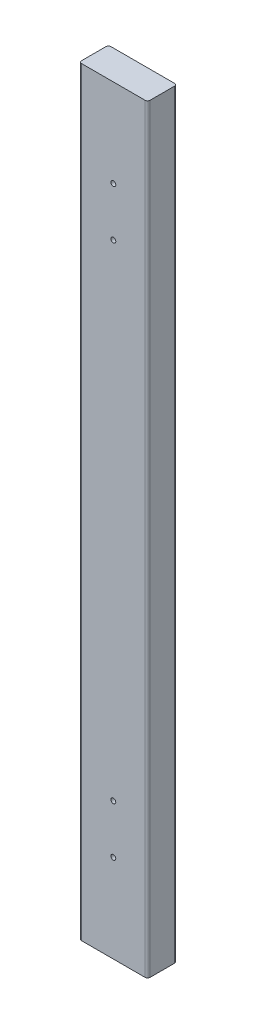
ISO-10303-21;
HEADER;
FILE_DESCRIPTION(('STEP AP214'),'2;1');
FILE_NAME('part.step','',(''),(''),'','','');
FILE_SCHEMA(('AUTOMOTIVE_DESIGN { 1 0 10303 214 1 1 1 1 }'));
ENDSEC;
DATA;
#1=APPLICATION_CONTEXT('core data for automotive mechanical design processes');
#2=APPLICATION_PROTOCOL_DEFINITION('international standard','automotive_design',2000,#1);
#3=PRODUCT_CONTEXT('',#1,'mechanical');
#4=PRODUCT('Part','Part','',(#3));
#5=PRODUCT_RELATED_PRODUCT_CATEGORY('part','',(#4));
#6=PRODUCT_DEFINITION_FORMATION('','',#4);
#7=PRODUCT_DEFINITION_CONTEXT('part definition',#1,'design');
#8=PRODUCT_DEFINITION('design','',#6,#7);
#9=PRODUCT_DEFINITION_SHAPE('','',#8);
#10=(LENGTH_UNIT() NAMED_UNIT(*) SI_UNIT(.MILLI.,.METRE.));
#11=(NAMED_UNIT(*) PLANE_ANGLE_UNIT() SI_UNIT($,.RADIAN.));
#12=(NAMED_UNIT(*) SI_UNIT($,.STERADIAN.) SOLID_ANGLE_UNIT());
#13=UNCERTAINTY_MEASURE_WITH_UNIT(LENGTH_MEASURE(1.E-05),#10,'distance_accuracy_value','');
#14=(GEOMETRIC_REPRESENTATION_CONTEXT(3) GLOBAL_UNCERTAINTY_ASSIGNED_CONTEXT((#13)) GLOBAL_UNIT_ASSIGNED_CONTEXT((#10,
#11,#12)) REPRESENTATION_CONTEXT('',''));
#15=CARTESIAN_POINT('',(0.,0.,0.));
#16=DIRECTION('',(0.,0.,1.));
#17=DIRECTION('',(1.,0.,0.));
#18=AXIS2_PLACEMENT_3D('',#15,#16,#17);
#19=CARTESIAN_POINT('',(-44.45,985.8375,-19.05));
#20=DIRECTION('',(1.,0.,0.));
#21=DIRECTION('',(0.,0.,-1.));
#22=AXIS2_PLACEMENT_3D('',#19,#20,#21);
#23=PLANE('',#22);
#24=DIRECTION('',(0.,0.,1.));
#25=VECTOR('',#24,1.);
#26=CARTESIAN_POINT('',(-44.45,985.8375,-19.05));
#27=LINE('',#26,#25);
#28=CARTESIAN_POINT('',(-44.45,985.8375,-15.875));
#29=VERTEX_POINT('',#28);
#30=CARTESIAN_POINT('',(-44.45,985.8375,15.875));
#31=VERTEX_POINT('',#30);
#32=EDGE_CURVE('E125',#29,#31,#27,.T.);
#33=ORIENTED_EDGE('',*,*,#32,.F.);
#34=DIRECTION('',(0.,-1.,0.));
#35=VECTOR('',#34,1.);
#36=CARTESIAN_POINT('',(-44.45,985.8375,-15.875));
#37=LINE('',#36,#35);
#38=CARTESIAN_POINT('',(-44.45,0.,-15.875));
#39=VERTEX_POINT('',#38);
#40=EDGE_CURVE('E151',#29,#39,#37,.T.);
#41=ORIENTED_EDGE('',*,*,#40,.T.);
#42=DIRECTION('',(0.,0.,1.));
#43=VECTOR('',#42,1.);
#44=CARTESIAN_POINT('',(-44.45,0.,-19.05));
#45=LINE('',#44,#43);
#46=CARTESIAN_POINT('',(-44.45,0.,15.875));
#47=VERTEX_POINT('',#46);
#48=EDGE_CURVE('E159',#39,#47,#45,.T.);
#49=ORIENTED_EDGE('',*,*,#48,.T.);
#50=DIRECTION('',(0.,-1.,0.));
#51=VECTOR('',#50,1.);
#52=CARTESIAN_POINT('',(-44.45,985.8375,15.875));
#53=LINE('',#52,#51);
#54=EDGE_CURVE('E149',#47,#31,#53,.F.);
#55=ORIENTED_EDGE('',*,*,#54,.T.);
#56=EDGE_LOOP('',(#33,#41,#49,#55));
#57=FACE_BOUND('',#56,.T.);
#58=ADVANCED_FACE('F34',(#57),#23,.F.);
#59=CARTESIAN_POINT('',(44.45,985.8375,19.05));
#60=DIRECTION('',(0.,0.,-1.));
#61=DIRECTION('',(-1.,0.,0.));
#62=AXIS2_PLACEMENT_3D('',#59,#60,#61);
#63=PLANE('',#62);
#64=CARTESIAN_POINT('',(0.,114.3,19.05));
#65=DIRECTION('',(0.,0.,1.));
#66=DIRECTION('',(1.,0.,0.));
#67=AXIS2_PLACEMENT_3D('',#64,#65,#66);
#68=CIRCLE('',#67,3.175);
#69=CARTESIAN_POINT('',(3.17499999999998,114.3,19.05));
#70=VERTEX_POINT('',#69);
#71=EDGE_CURVE('E188',#70,#70,#68,.T.);
#72=ORIENTED_EDGE('',*,*,#71,.F.);
#73=EDGE_LOOP('',(#72));
#74=FACE_BOUND('',#73,.T.);
#75=CARTESIAN_POINT('',(0.,177.8,19.05));
#76=DIRECTION('',(0.,0.,1.));
#77=DIRECTION('',(1.,0.,0.));
#78=AXIS2_PLACEMENT_3D('',#75,#76,#77);
#79=CIRCLE('',#78,3.175);
#80=CARTESIAN_POINT('',(3.17500000000001,177.8,19.05));
#81=VERTEX_POINT('',#80);
#82=EDGE_CURVE('E182',#81,#81,#79,.T.);
#83=ORIENTED_EDGE('',*,*,#82,.F.);
#84=EDGE_LOOP('',(#83));
#85=FACE_BOUND('',#84,.T.);
#86=CARTESIAN_POINT('',(0.,808.0375,19.05));
#87=DIRECTION('',(0.,0.,1.));
#88=DIRECTION('',(1.,0.,0.));
#89=AXIS2_PLACEMENT_3D('',#86,#87,#88);
#90=CIRCLE('',#89,3.175);
#91=CARTESIAN_POINT('',(3.17499999999998,808.0375,19.05));
#92=VERTEX_POINT('',#91);
#93=EDGE_CURVE('E176',#92,#92,#90,.T.);
#94=ORIENTED_EDGE('',*,*,#93,.F.);
#95=EDGE_LOOP('',(#94));
#96=FACE_BOUND('',#95,.T.);
#97=CARTESIAN_POINT('',(0.,871.5375,19.05));
#98=DIRECTION('',(0.,0.,1.));
#99=DIRECTION('',(1.,0.,0.));
#100=AXIS2_PLACEMENT_3D('',#97,#98,#99);
#101=CIRCLE('',#100,3.175);
#102=CARTESIAN_POINT('',(3.17499999999998,871.5375,19.05));
#103=VERTEX_POINT('',#102);
#104=EDGE_CURVE('E170',#103,#103,#101,.T.);
#105=ORIENTED_EDGE('',*,*,#104,.F.);
#106=EDGE_LOOP('',(#105));
#107=FACE_BOUND('',#106,.T.);
#108=DIRECTION('',(1.,0.,0.));
#109=VECTOR('',#108,1.);
#110=CARTESIAN_POINT('',(44.45,0.,19.05));
#111=LINE('',#110,#109);
#112=CARTESIAN_POINT('',(-41.275,0.,19.05));
#113=VERTEX_POINT('',#112);
#114=CARTESIAN_POINT('',(41.275,0.,19.05));
#115=VERTEX_POINT('',#114);
#116=EDGE_CURVE('E130',#113,#115,#111,.T.);
#117=ORIENTED_EDGE('',*,*,#116,.T.);
#118=DIRECTION('',(0.,-1.,0.));
#119=VECTOR('',#118,1.);
#120=CARTESIAN_POINT('',(41.275,985.8375,19.05));
#121=LINE('',#120,#119);
#122=CARTESIAN_POINT('',(41.275,985.8375,19.05));
#123=VERTEX_POINT('',#122);
#124=EDGE_CURVE('E11',#115,#123,#121,.F.);
#125=ORIENTED_EDGE('',*,*,#124,.T.);
#126=DIRECTION('',(1.,0.,0.));
#127=VECTOR('',#126,1.);
#128=CARTESIAN_POINT('',(44.45,985.8375,19.05));
#129=LINE('',#128,#127);
#130=CARTESIAN_POINT('',(-41.275,985.8375,19.05));
#131=VERTEX_POINT('',#130);
#132=EDGE_CURVE('E128',#131,#123,#129,.T.);
#133=ORIENTED_EDGE('',*,*,#132,.F.);
#134=DIRECTION('',(0.,-1.,0.));
#135=VECTOR('',#134,1.);
#136=CARTESIAN_POINT('',(-41.275,985.8375,19.05));
#137=LINE('',#136,#135);
#138=EDGE_CURVE('E42',#131,#113,#137,.T.);
#139=ORIENTED_EDGE('',*,*,#138,.T.);
#140=EDGE_LOOP('',(#117,#125,#133,#139));
#141=FACE_BOUND('',#140,.T.);
#142=ADVANCED_FACE('F156',(#74,#85,#96,#107,#141),#63,.F.);
#143=CARTESIAN_POINT('',(44.45,985.8375,-19.05));
#144=DIRECTION('',(-1.,0.,0.));
#145=DIRECTION('',(0.,0.,1.));
#146=AXIS2_PLACEMENT_3D('',#143,#144,#145);
#147=PLANE('',#146);
#148=DIRECTION('',(0.,0.,-1.));
#149=VECTOR('',#148,1.);
#150=CARTESIAN_POINT('',(44.45,0.,-19.05));
#151=LINE('',#150,#149);
#152=CARTESIAN_POINT('',(44.45,0.,15.875));
#153=VERTEX_POINT('',#152);
#154=CARTESIAN_POINT('',(44.45,0.,-15.875));
#155=VERTEX_POINT('',#154);
#156=EDGE_CURVE('E126',#153,#155,#151,.T.);
#157=ORIENTED_EDGE('',*,*,#156,.T.);
#158=DIRECTION('',(0.,-1.,0.));
#159=VECTOR('',#158,1.);
#160=CARTESIAN_POINT('',(44.45,985.8375,-15.875));
#161=LINE('',#160,#159);
#162=CARTESIAN_POINT('',(44.45,985.8375,-15.875));
#163=VERTEX_POINT('',#162);
#164=EDGE_CURVE('E104',#155,#163,#161,.F.);
#165=ORIENTED_EDGE('',*,*,#164,.T.);
#166=DIRECTION('',(0.,0.,-1.));
#167=VECTOR('',#166,1.);
#168=CARTESIAN_POINT('',(44.45,985.8375,-19.05));
#169=LINE('',#168,#167);
#170=CARTESIAN_POINT('',(44.45,985.8375,15.875));
#171=VERTEX_POINT('',#170);
#172=EDGE_CURVE('E164',#171,#163,#169,.T.);
#173=ORIENTED_EDGE('',*,*,#172,.F.);
#174=DIRECTION('',(0.,-1.,0.));
#175=VECTOR('',#174,1.);
#176=CARTESIAN_POINT('',(44.45,985.8375,15.875));
#177=LINE('',#176,#175);
#178=EDGE_CURVE('E109',#171,#153,#177,.T.);
#179=ORIENTED_EDGE('',*,*,#178,.T.);
#180=EDGE_LOOP('',(#157,#165,#173,#179));
#181=FACE_BOUND('',#180,.T.);
#182=ADVANCED_FACE('F196',(#181),#147,.F.);
#183=CARTESIAN_POINT('',(44.45,985.8375,-19.05));
#184=DIRECTION('',(0.,0.,1.));
#185=DIRECTION('',(1.,0.,0.));
#186=AXIS2_PLACEMENT_3D('',#183,#184,#185);
#187=PLANE('',#186);
#188=CARTESIAN_POINT('',(0.,114.3,-19.05));
#189=DIRECTION('',(0.,0.,1.));
#190=DIRECTION('',(1.,0.,0.));
#191=AXIS2_PLACEMENT_3D('',#188,#189,#190);
#192=CIRCLE('',#191,3.175);
#193=CARTESIAN_POINT('',(3.17499999999998,114.3,-19.05));
#194=VERTEX_POINT('',#193);
#195=EDGE_CURVE('E185',#194,#194,#192,.T.);
#196=ORIENTED_EDGE('',*,*,#195,.T.);
#197=EDGE_LOOP('',(#196));
#198=FACE_BOUND('',#197,.T.);
#199=CARTESIAN_POINT('',(0.,177.8,-19.05));
#200=DIRECTION('',(0.,0.,1.));
#201=DIRECTION('',(1.,0.,0.));
#202=AXIS2_PLACEMENT_3D('',#199,#200,#201);
#203=CIRCLE('',#202,3.175);
#204=CARTESIAN_POINT('',(3.175,177.8,-19.05));
#205=VERTEX_POINT('',#204);
#206=EDGE_CURVE('E179',#205,#205,#203,.T.);
#207=ORIENTED_EDGE('',*,*,#206,.T.);
#208=EDGE_LOOP('',(#207));
#209=FACE_BOUND('',#208,.T.);
#210=CARTESIAN_POINT('',(0.,808.0375,-19.05));
#211=DIRECTION('',(0.,0.,1.));
#212=DIRECTION('',(1.,0.,0.));
#213=AXIS2_PLACEMENT_3D('',#210,#211,#212);
#214=CIRCLE('',#213,3.175);
#215=CARTESIAN_POINT('',(3.17499999999998,808.0375,-19.05));
#216=VERTEX_POINT('',#215);
#217=EDGE_CURVE('E173',#216,#216,#214,.T.);
#218=ORIENTED_EDGE('',*,*,#217,.T.);
#219=EDGE_LOOP('',(#218));
#220=FACE_BOUND('',#219,.T.);
#221=CARTESIAN_POINT('',(0.,871.5375,-19.05));
#222=DIRECTION('',(0.,0.,1.));
#223=DIRECTION('',(1.,0.,0.));
#224=AXIS2_PLACEMENT_3D('',#221,#222,#223);
#225=CIRCLE('',#224,3.175);
#226=CARTESIAN_POINT('',(3.17499999999998,871.5375,-19.05));
#227=VERTEX_POINT('',#226);
#228=EDGE_CURVE('E160',#227,#227,#225,.T.);
#229=ORIENTED_EDGE('',*,*,#228,.T.);
#230=EDGE_LOOP('',(#229));
#231=FACE_BOUND('',#230,.T.);
#232=DIRECTION('',(-1.,0.,0.));
#233=VECTOR('',#232,1.);
#234=CARTESIAN_POINT('',(44.45,985.8375,-19.05));
#235=LINE('',#234,#233);
#236=CARTESIAN_POINT('',(41.275,985.8375,-19.05));
#237=VERTEX_POINT('',#236);
#238=CARTESIAN_POINT('',(-41.275,985.8375,-19.05));
#239=VERTEX_POINT('',#238);
#240=EDGE_CURVE('E119',#237,#239,#235,.T.);
#241=ORIENTED_EDGE('',*,*,#240,.F.);
#242=DIRECTION('',(0.,-1.,0.));
#243=VECTOR('',#242,1.);
#244=CARTESIAN_POINT('',(41.275,985.8375,-19.05));
#245=LINE('',#244,#243);
#246=CARTESIAN_POINT('',(41.275,0.,-19.05));
#247=VERTEX_POINT('',#246);
#248=EDGE_CURVE('E103',#237,#247,#245,.T.);
#249=ORIENTED_EDGE('',*,*,#248,.T.);
#250=DIRECTION('',(-1.,0.,0.));
#251=VECTOR('',#250,1.);
#252=CARTESIAN_POINT('',(44.45,0.,-19.05));
#253=LINE('',#252,#251);
#254=CARTESIAN_POINT('',(-41.275,0.,-19.05));
#255=VERTEX_POINT('',#254);
#256=EDGE_CURVE('E116',#247,#255,#253,.T.);
#257=ORIENTED_EDGE('',*,*,#256,.T.);
#258=DIRECTION('',(0.,-1.,0.));
#259=VECTOR('',#258,1.);
#260=CARTESIAN_POINT('',(-41.275,985.8375,-19.05));
#261=LINE('',#260,#259);
#262=EDGE_CURVE('E121',#255,#239,#261,.F.);
#263=ORIENTED_EDGE('',*,*,#262,.T.);
#264=EDGE_LOOP('',(#241,#249,#257,#263));
#265=FACE_BOUND('',#264,.T.);
#266=ADVANCED_FACE('F115',(#198,#209,#220,#231,#265),#187,.F.);
#267=CARTESIAN_POINT('',(0.,985.8375,0.));
#268=DIRECTION('',(0.,-1.,0.));
#269=DIRECTION('',(0.,0.,-1.));
#270=AXIS2_PLACEMENT_3D('',#267,#268,#269);
#271=PLANE('',#270);
#272=ORIENTED_EDGE('',*,*,#172,.T.);
#273=CARTESIAN_POINT('',(41.275,985.8375,-15.875));
#274=DIRECTION('',(0.,-1.,0.));
#275=DIRECTION('',(0.,0.,-1.));
#276=AXIS2_PLACEMENT_3D('',#273,#274,#275);
#277=CIRCLE('',#276,3.175);
#278=EDGE_CURVE('E147',#163,#237,#277,.F.);
#279=ORIENTED_EDGE('',*,*,#278,.T.);
#280=ORIENTED_EDGE('',*,*,#240,.T.);
#281=CARTESIAN_POINT('',(-41.275,985.8375,-15.875));
#282=DIRECTION('',(0.,-1.,0.));
#283=DIRECTION('',(0.,0.,-1.));
#284=AXIS2_PLACEMENT_3D('',#281,#282,#283);
#285=CIRCLE('',#284,3.175);
#286=EDGE_CURVE('E145',#239,#29,#285,.F.);
#287=ORIENTED_EDGE('',*,*,#286,.T.);
#288=ORIENTED_EDGE('',*,*,#32,.T.);
#289=CARTESIAN_POINT('',(-41.275,985.8375,15.875));
#290=DIRECTION('',(0.,-1.,0.));
#291=DIRECTION('',(0.,0.,-1.));
#292=AXIS2_PLACEMENT_3D('',#289,#290,#291);
#293=CIRCLE('',#292,3.175);
#294=EDGE_CURVE('E54',#31,#131,#293,.F.);
#295=ORIENTED_EDGE('',*,*,#294,.T.);
#296=ORIENTED_EDGE('',*,*,#132,.T.);
#297=CARTESIAN_POINT('',(41.275,985.8375,15.875));
#298=DIRECTION('',(0.,-1.,0.));
#299=DIRECTION('',(0.,0.,-1.));
#300=AXIS2_PLACEMENT_3D('',#297,#298,#299);
#301=CIRCLE('',#300,3.175);
#302=EDGE_CURVE('E143',#123,#171,#301,.F.);
#303=ORIENTED_EDGE('',*,*,#302,.T.);
#304=EDGE_LOOP('',(#272,#279,#280,#287,#288,#295,#296,#303));
#305=FACE_BOUND('',#304,.T.);
#306=ADVANCED_FACE('F239',(#305),#271,.F.);
#307=CARTESIAN_POINT('',(0.,0.,0.));
#308=DIRECTION('',(0.,-1.,0.));
#309=DIRECTION('',(0.,0.,-1.));
#310=AXIS2_PLACEMENT_3D('',#307,#308,#309);
#311=PLANE('',#310);
#312=ORIENTED_EDGE('',*,*,#256,.F.);
#313=CARTESIAN_POINT('',(41.275,0.,-15.875));
#314=DIRECTION('',(0.,-1.,0.));
#315=DIRECTION('',(0.,0.,-1.));
#316=AXIS2_PLACEMENT_3D('',#313,#314,#315);
#317=CIRCLE('',#316,3.175);
#318=EDGE_CURVE('E99',#247,#155,#317,.T.);
#319=ORIENTED_EDGE('',*,*,#318,.T.);
#320=ORIENTED_EDGE('',*,*,#156,.F.);
#321=CARTESIAN_POINT('',(41.275,0.,15.875));
#322=DIRECTION('',(0.,-1.,0.));
#323=DIRECTION('',(0.,0.,-1.));
#324=AXIS2_PLACEMENT_3D('',#321,#322,#323);
#325=CIRCLE('',#324,3.175);
#326=EDGE_CURVE('E136',#153,#115,#325,.T.);
#327=ORIENTED_EDGE('',*,*,#326,.T.);
#328=ORIENTED_EDGE('',*,*,#116,.F.);
#329=CARTESIAN_POINT('',(-41.275,0.,15.875));
#330=DIRECTION('',(0.,-1.,0.));
#331=DIRECTION('',(0.,0.,-1.));
#332=AXIS2_PLACEMENT_3D('',#329,#330,#331);
#333=CIRCLE('',#332,3.175);
#334=EDGE_CURVE('E120',#113,#47,#333,.T.);
#335=ORIENTED_EDGE('',*,*,#334,.T.);
#336=ORIENTED_EDGE('',*,*,#48,.F.);
#337=CARTESIAN_POINT('',(-41.275,0.,-15.875));
#338=DIRECTION('',(0.,-1.,0.));
#339=DIRECTION('',(0.,0.,-1.));
#340=AXIS2_PLACEMENT_3D('',#337,#338,#339);
#341=CIRCLE('',#340,3.175);
#342=EDGE_CURVE('E110',#39,#255,#341,.T.);
#343=ORIENTED_EDGE('',*,*,#342,.T.);
#344=EDGE_LOOP('',(#312,#319,#320,#327,#328,#335,#336,#343));
#345=FACE_BOUND('',#344,.T.);
#346=ADVANCED_FACE('F123',(#345),#311,.T.);
#347=CARTESIAN_POINT('',(41.275,985.8375,-15.875));
#348=DIRECTION('',(0.,-1.,0.));
#349=DIRECTION('',(0.,0.,-1.));
#350=AXIS2_PLACEMENT_3D('',#347,#348,#349);
#351=CYLINDRICAL_SURFACE('',#350,3.175);
#352=ORIENTED_EDGE('',*,*,#278,.F.);
#353=ORIENTED_EDGE('',*,*,#164,.F.);
#354=ORIENTED_EDGE('',*,*,#318,.F.);
#355=ORIENTED_EDGE('',*,*,#248,.F.);
#356=EDGE_LOOP('',(#352,#353,#354,#355));
#357=FACE_BOUND('',#356,.T.);
#358=ADVANCED_FACE('F102',(#357),#351,.T.);
#359=CARTESIAN_POINT('',(-41.275,985.8375,-15.875));
#360=DIRECTION('',(0.,-1.,0.));
#361=DIRECTION('',(0.,0.,-1.));
#362=AXIS2_PLACEMENT_3D('',#359,#360,#361);
#363=CYLINDRICAL_SURFACE('',#362,3.175);
#364=ORIENTED_EDGE('',*,*,#286,.F.);
#365=ORIENTED_EDGE('',*,*,#262,.F.);
#366=ORIENTED_EDGE('',*,*,#342,.F.);
#367=ORIENTED_EDGE('',*,*,#40,.F.);
#368=EDGE_LOOP('',(#364,#365,#366,#367));
#369=FACE_BOUND('',#368,.T.);
#370=ADVANCED_FACE('F229',(#369),#363,.T.);
#371=CARTESIAN_POINT('',(41.275,985.8375,15.875));
#372=DIRECTION('',(0.,-1.,0.));
#373=DIRECTION('',(0.,0.,-1.));
#374=AXIS2_PLACEMENT_3D('',#371,#372,#373);
#375=CYLINDRICAL_SURFACE('',#374,3.175);
#376=ORIENTED_EDGE('',*,*,#302,.F.);
#377=ORIENTED_EDGE('',*,*,#124,.F.);
#378=ORIENTED_EDGE('',*,*,#326,.F.);
#379=ORIENTED_EDGE('',*,*,#178,.F.);
#380=EDGE_LOOP('',(#376,#377,#378,#379));
#381=FACE_BOUND('',#380,.T.);
#382=ADVANCED_FACE('F216',(#381),#375,.T.);
#383=CARTESIAN_POINT('',(-41.275,985.8375,15.875));
#384=DIRECTION('',(0.,-1.,0.));
#385=DIRECTION('',(0.,0.,-1.));
#386=AXIS2_PLACEMENT_3D('',#383,#384,#385);
#387=CYLINDRICAL_SURFACE('',#386,3.175);
#388=ORIENTED_EDGE('',*,*,#294,.F.);
#389=ORIENTED_EDGE('',*,*,#54,.F.);
#390=ORIENTED_EDGE('',*,*,#334,.F.);
#391=ORIENTED_EDGE('',*,*,#138,.F.);
#392=EDGE_LOOP('',(#388,#389,#390,#391));
#393=FACE_BOUND('',#392,.T.);
#394=ADVANCED_FACE('F36',(#393),#387,.T.);
#395=CARTESIAN_POINT('',(0.,871.5375,19.05));
#396=DIRECTION('',(0.,0.,1.));
#397=DIRECTION('',(1.,0.,0.));
#398=AXIS2_PLACEMENT_3D('',#395,#396,#397);
#399=CYLINDRICAL_SURFACE('',#398,3.175);
#400=ORIENTED_EDGE('',*,*,#228,.F.);
#401=EDGE_LOOP('',(#400));
#402=FACE_BOUND('',#401,.T.);
#403=ORIENTED_EDGE('',*,*,#104,.T.);
#404=EDGE_LOOP('',(#403));
#405=FACE_BOUND('',#404,.T.);
#406=ADVANCED_FACE('F204',(#402,#405),#399,.F.);
#407=CARTESIAN_POINT('',(0.,808.0375,19.05));
#408=DIRECTION('',(0.,0.,1.));
#409=DIRECTION('',(1.,0.,0.));
#410=AXIS2_PLACEMENT_3D('',#407,#408,#409);
#411=CYLINDRICAL_SURFACE('',#410,3.175);
#412=ORIENTED_EDGE('',*,*,#217,.F.);
#413=EDGE_LOOP('',(#412));
#414=FACE_BOUND('',#413,.T.);
#415=ORIENTED_EDGE('',*,*,#93,.T.);
#416=EDGE_LOOP('',(#415));
#417=FACE_BOUND('',#416,.T.);
#418=ADVANCED_FACE('F206',(#414,#417),#411,.F.);
#419=CARTESIAN_POINT('',(0.,177.8,19.05));
#420=DIRECTION('',(0.,0.,1.));
#421=DIRECTION('',(1.,0.,0.));
#422=AXIS2_PLACEMENT_3D('',#419,#420,#421);
#423=CYLINDRICAL_SURFACE('',#422,3.175);
#424=ORIENTED_EDGE('',*,*,#206,.F.);
#425=EDGE_LOOP('',(#424));
#426=FACE_BOUND('',#425,.T.);
#427=ORIENTED_EDGE('',*,*,#82,.T.);
#428=EDGE_LOOP('',(#427));
#429=FACE_BOUND('',#428,.T.);
#430=ADVANCED_FACE('F213',(#426,#429),#423,.F.);
#431=CARTESIAN_POINT('',(0.,114.3,19.05));
#432=DIRECTION('',(0.,0.,1.));
#433=DIRECTION('',(1.,0.,0.));
#434=AXIS2_PLACEMENT_3D('',#431,#432,#433);
#435=CYLINDRICAL_SURFACE('',#434,3.175);
#436=ORIENTED_EDGE('',*,*,#195,.F.);
#437=EDGE_LOOP('',(#436));
#438=FACE_BOUND('',#437,.T.);
#439=ORIENTED_EDGE('',*,*,#71,.T.);
#440=EDGE_LOOP('',(#439));
#441=FACE_BOUND('',#440,.T.);
#442=ADVANCED_FACE('F192',(#438,#441),#435,.F.);
#443=CLOSED_SHELL('',(#58,#142,#182,#266,#306,#346,#358,#370,#382,#394,#406,#418,#430,#442));
#444=MANIFOLD_SOLID_BREP('B2',#443);
#445=ADVANCED_BREP_SHAPE_REPRESENTATION('',(#18,#444),#14);
#446=SHAPE_DEFINITION_REPRESENTATION(#9,#445);
ENDSEC;
END-ISO-10303-21;
